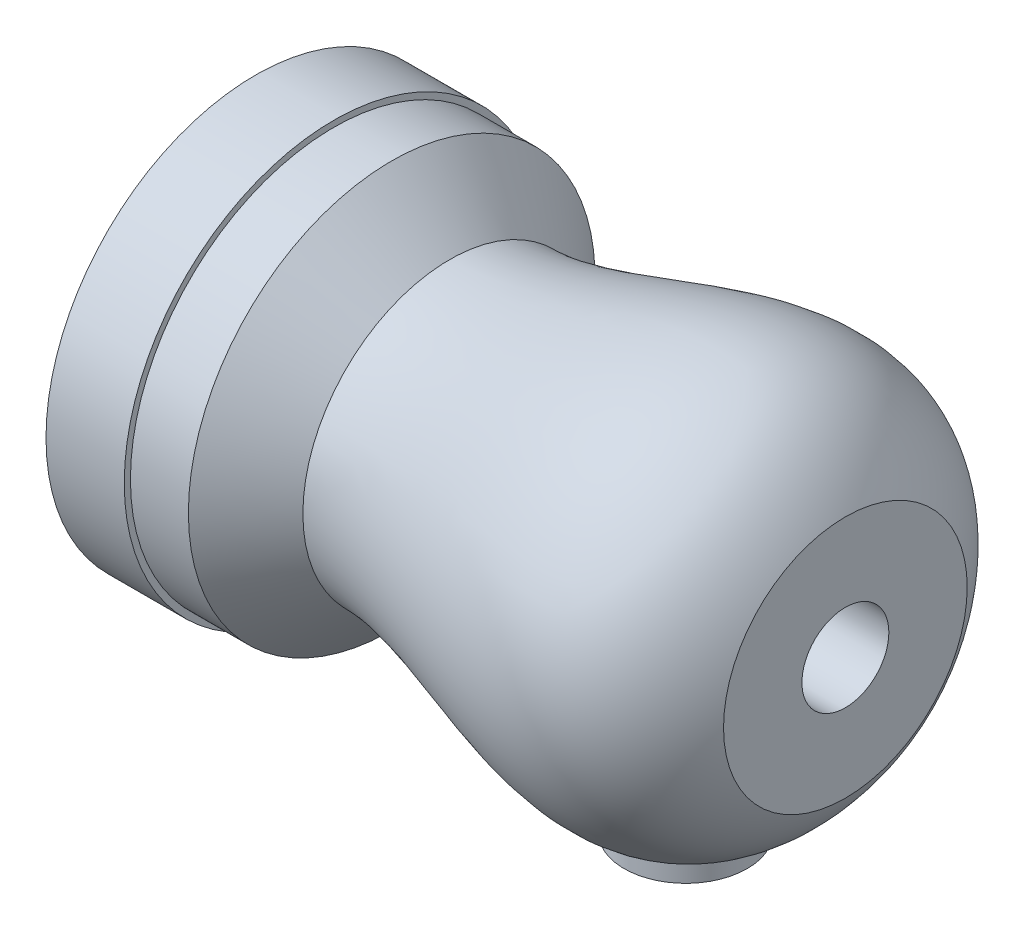
ISO-10303-21;
HEADER;
FILE_DESCRIPTION(('STEP AP214'),'2;1');
FILE_NAME('part.step','',(''),(''),'','','');
FILE_SCHEMA(('AUTOMOTIVE_DESIGN { 1 0 10303 214 1 1 1 1 }'));
ENDSEC;
DATA;
#1=APPLICATION_CONTEXT('core data for automotive mechanical design processes');
#2=APPLICATION_PROTOCOL_DEFINITION('international standard','automotive_design',2000,#1);
#3=PRODUCT_CONTEXT('',#1,'mechanical');
#4=PRODUCT('Part','Part','',(#3));
#5=PRODUCT_RELATED_PRODUCT_CATEGORY('part','',(#4));
#6=PRODUCT_DEFINITION_FORMATION('','',#4);
#7=PRODUCT_DEFINITION_CONTEXT('part definition',#1,'design');
#8=PRODUCT_DEFINITION('design','',#6,#7);
#9=PRODUCT_DEFINITION_SHAPE('','',#8);
#10=(LENGTH_UNIT() NAMED_UNIT(*) SI_UNIT(.MILLI.,.METRE.));
#11=(NAMED_UNIT(*) PLANE_ANGLE_UNIT() SI_UNIT($,.RADIAN.));
#12=(NAMED_UNIT(*) SI_UNIT($,.STERADIAN.) SOLID_ANGLE_UNIT());
#13=UNCERTAINTY_MEASURE_WITH_UNIT(LENGTH_MEASURE(1.E-05),#10,'distance_accuracy_value','');
#14=(GEOMETRIC_REPRESENTATION_CONTEXT(3) GLOBAL_UNCERTAINTY_ASSIGNED_CONTEXT((#13)) GLOBAL_UNIT_ASSIGNED_CONTEXT((#10,
#11,#12)) REPRESENTATION_CONTEXT('',''));
#15=CARTESIAN_POINT('',(0.,0.,0.));
#16=DIRECTION('',(0.,0.,1.));
#17=DIRECTION('',(1.,0.,0.));
#18=AXIS2_PLACEMENT_3D('',#15,#16,#17);
#19=CARTESIAN_POINT('',(176.495570271617,42.0294814328911,0.));
#20=CARTESIAN_POINT('',(143.705322116077,100.003369352292,0.));
#21=CARTESIAN_POINT('',(85.3897214599743,50.7333126279115,0.));
#22=CARTESIAN_POINT('',(40.,50.6507572834825,0.));
#23=B_SPLINE_CURVE_WITH_KNOTS('',3,(#19,#20,#21,#22),.UNSPECIFIED.,.F.,.F.,(4,4),(0.,1.),.UNSPECIFIED.);
#24=CARTESIAN_POINT('',(0.,0.,0.));
#25=DIRECTION('',(-1.,0.,0.));
#26=AXIS1_PLACEMENT('',#24,#25);
#27=SURFACE_OF_REVOLUTION('',#23,#26);
#28=CARTESIAN_POINT('',(176.495570271617,0.,0.));
#29=DIRECTION('',(-1.,0.,0.));
#30=DIRECTION('',(0.,0.,1.));
#31=AXIS2_PLACEMENT_3D('',#28,#29,#30);
#32=CIRCLE('',#31,42.0294814328911);
#33=CARTESIAN_POINT('',(176.495570271617,0.,42.0294814328911));
#34=VERTEX_POINT('',#33);
#35=EDGE_CURVE('E112',#34,#34,#32,.T.);
#36=ORIENTED_EDGE('',*,*,#35,.T.);
#37=EDGE_LOOP('',(#36));
#38=FACE_BOUND('',#37,.T.);
#39=CARTESIAN_POINT('',(40.,0.,0.));
#40=DIRECTION('',(-1.,0.,0.));
#41=DIRECTION('',(0.,0.,1.));
#42=AXIS2_PLACEMENT_3D('',#39,#40,#41);
#43=CIRCLE('',#42,50.6507572834825);
#44=CARTESIAN_POINT('',(40.,0.,50.6507572834825));
#45=VERTEX_POINT('',#44);
#46=EDGE_CURVE('E114',#45,#45,#43,.T.);
#47=ORIENTED_EDGE('',*,*,#46,.F.);
#48=EDGE_LOOP('',(#47));
#49=FACE_BOUND('',#48,.T.);
#50=CARTESIAN_POINT('',(121.401340982903,-66.234012494018,-21.25));
#51=CARTESIAN_POINT('',(122.003957982203,-66.3167599790187,-21.2500045300251));
#52=CARTESIAN_POINT('',(122.606216079359,-66.4015069637167,-21.2243586624418));
#53=CARTESIAN_POINT('',(123.806235777613,-66.5734372812848,-21.1220645786052));
#54=CARTESIAN_POINT('',(124.403996165585,-66.6606212435302,-21.0454030682312));
#55=CARTESIAN_POINT('',(125.591398067185,-66.8358485961059,-20.8415267641632));
#56=CARTESIAN_POINT('',(126.181029715917,-66.9238928411712,-20.7142553301676));
#57=CARTESIAN_POINT('',(127.347429843309,-67.0991153764761,-20.4100403479368));
#58=CARTESIAN_POINT('',(127.924199175922,-67.1862937239899,-20.2331001079707));
#59=CARTESIAN_POINT('',(129.060811307519,-67.3582411691843,-19.8307434150008));
#60=CARTESIAN_POINT('',(129.620657545908,-67.4430107562023,-19.6053368887474));
#61=CARTESIAN_POINT('',(130.719625591626,-67.6087794303558,-19.1074845679912));
#62=CARTESIAN_POINT('',(131.258747083308,-67.6897784600683,-18.8350380573979));
#63=CARTESIAN_POINT('',(132.312217291834,-67.8467934365864,-18.2449895290065));
#64=CARTESIAN_POINT('',(132.826574057052,-67.9228110052736,-17.9274023160735));
#65=CARTESIAN_POINT('',(133.826928780006,-68.0689377317553,-17.2491288342234));
#66=CARTESIAN_POINT('',(134.312927051726,-68.13904695497,-16.8884430426235));
#67=CARTESIAN_POINT('',(135.250030549563,-68.2722436050248,-16.1287897584023));
#68=CARTESIAN_POINT('',(135.70133243024,-68.3353716587939,-15.7300719964799));
#69=CARTESIAN_POINT('',(136.568939742958,-68.4546613968304,-14.8952627342508));
#70=CARTESIAN_POINT('',(136.985245230865,-68.5108230922187,-14.459171293608));
#71=CARTESIAN_POINT('',(137.779683052371,-68.6159799601773,-13.5526978040432));
#72=CARTESIAN_POINT('',(138.157815346672,-68.6649751253698,-13.0823157198207));
#73=CARTESIAN_POINT('',(138.872994999654,-68.7558092821973,-12.1106441612038));
#74=CARTESIAN_POINT('',(139.210042743245,-68.7976483408773,-11.6093549764357));
#75=CARTESIAN_POINT('',(139.836107684897,-68.8738224284479,-10.5866145378172));
#76=CARTESIAN_POINT('',(140.125722502654,-68.9082528788129,-10.0655360960294));
#77=CARTESIAN_POINT('',(140.660286844037,-68.9706158244899,-9.00058152336909));
#78=CARTESIAN_POINT('',(140.905236773021,-68.9985483787747,-8.45670559945187));
#79=CARTESIAN_POINT('',(141.348633305942,-69.0482616845713,-7.35005739808419));
#80=CARTESIAN_POINT('',(141.547080735037,-69.0700425452425,-6.78728545613469));
#81=CARTESIAN_POINT('',(141.895997203266,-69.1078075114209,-5.64686973023211));
#82=CARTESIAN_POINT('',(142.046466241317,-69.1237916167972,-5.06922594594312));
#83=CARTESIAN_POINT('',(142.297784675641,-69.1502222154461,-3.90563088654723));
#84=CARTESIAN_POINT('',(142.398837307729,-69.160691403992,-3.31972401047234));
#85=CARTESIAN_POINT('',(142.55151026833,-69.1764242154281,-2.1414373684221));
#86=CARTESIAN_POINT('',(142.603130772608,-69.1816878568276,-1.54905762546986));
#87=CARTESIAN_POINT('',(142.656561540501,-69.187135041618,-0.362034305631213));
#88=CARTESIAN_POINT('',(142.658371913696,-69.1873185961849,0.232609266272018));
#89=CARTESIAN_POINT('',(142.612169507954,-69.1826101243166,1.4199382334047));
#90=CARTESIAN_POINT('',(142.564156674582,-69.1777180923361,2.01262362649401));
#91=CARTESIAN_POINT('',(142.418635135676,-69.1627389608207,3.19202175517637));
#92=CARTESIAN_POINT('',(142.321109897238,-69.1526501259824,3.77873242892954));
#93=CARTESIAN_POINT('',(142.077271447734,-69.1270514302526,4.94180615295374));
#94=CARTESIAN_POINT('',(141.930958248918,-69.1115415707225,5.51816920582318));
#95=CARTESIAN_POINT('',(141.590625301726,-69.0747951111576,6.65643771696823));
#96=CARTESIAN_POINT('',(141.396606253653,-69.0535585951874,7.21834338733894));
#97=CARTESIAN_POINT('',(140.96229725852,-69.0050099858598,8.32370721658004));
#98=CARTESIAN_POINT('',(140.72200734552,-68.9776978969745,8.86716538902885));
#99=CARTESIAN_POINT('',(140.197030322258,-68.9166633206401,9.93159595420715));
#100=CARTESIAN_POINT('',(139.912358019292,-68.8829429703606,10.452575772642));
#101=CARTESIAN_POINT('',(139.300679142264,-68.8087961943795,11.4685563723769));
#102=CARTESIAN_POINT('',(138.973672618082,-68.768369776579,11.9635571842847));
#103=CARTESIAN_POINT('',(138.279769413145,-68.6806281699443,12.9240929843224));
#104=CARTESIAN_POINT('',(137.912873660234,-68.6333131413339,13.3896286574269));
#105=CARTESIAN_POINT('',(137.14190979907,-68.5317631556251,14.2880148342655));
#106=CARTESIAN_POINT('',(136.737841628695,-68.4775281869621,14.7208652833736));
#107=CARTESIAN_POINT('',(135.894858688906,-68.362210656287,15.5515645163));
#108=CARTESIAN_POINT('',(135.455890993059,-68.3011176336741,15.9493581320392));
#109=CARTESIAN_POINT('',(134.546860022997,-68.1725346329196,16.7065179649474));
#110=CARTESIAN_POINT('',(134.076796743471,-68.1050446536853,17.0658841755525));
#111=CARTESIAN_POINT('',(133.108918574364,-67.9642789952212,17.7438513097352));
#112=CARTESIAN_POINT('',(132.611101997867,-67.8910029641875,18.0624497514582));
#113=CARTESIAN_POINT('',(131.591242314525,-67.7395157406808,18.6568156476806));
#114=CARTESIAN_POINT('',(131.069198977734,-67.6613045013631,18.9325826955414));
#115=CARTESIAN_POINT('',(129.998721498627,-67.5001428392745,19.4422932355546));
#116=CARTESIAN_POINT('',(129.45006311242,-67.4171503328113,19.6757525063233));
#117=CARTESIAN_POINT('',(128.335440095248,-67.2485000567285,20.0956576727819));
#118=CARTESIAN_POINT('',(127.769475339763,-67.1628422679323,20.2821032301212));
#119=CARTESIAN_POINT('',(126.624009610692,-66.9902979604501,20.6068107463411));
#120=CARTESIAN_POINT('',(126.044507283121,-66.9034113192044,20.7450678633694));
#121=CARTESIAN_POINT('',(124.87589381478,-66.7299653270269,20.9724660533488));
#122=CARTESIAN_POINT('',(124.286782602685,-66.6434059785305,21.0616067615537));
#123=CARTESIAN_POINT('',(123.095175593833,-66.4710932185638,21.1909705424382));
#124=CARTESIAN_POINT('',(122.492605354982,-66.3853649091846,21.2305426817636));
#125=CARTESIAN_POINT('',(121.285772855895,-66.2175120781191,21.2582560402217));
#126=CARTESIAN_POINT('',(120.68151057897,-66.1353875921093,21.2463967503169));
#127=CARTESIAN_POINT('',(119.475544837851,-65.9762892424883,21.1711781469502));
#128=CARTESIAN_POINT('',(118.873841234508,-65.8993150953444,21.1078216710026));
#129=CARTESIAN_POINT('',(117.677247689856,-65.7518896726546,20.9298707543026));
#130=CARTESIAN_POINT('',(117.082357669134,-65.6814383210165,20.8152769113549));
#131=CARTESIAN_POINT('',(115.907970062168,-65.5486789103122,20.5364790786779));
#132=CARTESIAN_POINT('',(115.328392458215,-65.4863158390567,20.3726384575581));
#133=CARTESIAN_POINT('',(114.18447919698,-65.3699696494513,19.9960491840794));
#134=CARTESIAN_POINT('',(113.620143489982,-65.3159865037649,19.7833006912711));
#135=CARTESIAN_POINT('',(112.511000381505,-65.2168985861254,19.3103025907736));
#136=CARTESIAN_POINT('',(111.966190956364,-65.1717928919437,19.0500579226147));
#137=CARTESIAN_POINT('',(110.900178214127,-65.0905858267725,18.4838391855692));
#138=CARTESIAN_POINT('',(110.378974572432,-65.0544843319369,18.1778657457402));
#139=CARTESIAN_POINT('',(109.373840800372,-64.9916581038749,17.5286292140295));
#140=CARTESIAN_POINT('',(108.889389221732,-64.9647675991405,17.1861890310022));
#141=CARTESIAN_POINT('',(107.950585125956,-64.918884649817,16.4618096187886));
#142=CARTESIAN_POINT('',(107.496232223766,-64.8998921041725,16.0798708950694));
#143=CARTESIAN_POINT('',(106.620931106776,-64.8689844706626,15.2791951086572));
#144=CARTESIAN_POINT('',(106.199983375656,-64.8570694852582,14.8604575133322));
#145=CARTESIAN_POINT('',(105.394537745715,-64.8392725994367,13.9891646108447));
#146=CARTESIAN_POINT('',(105.010039994107,-64.8333907233849,13.5366091671129));
#147=CARTESIAN_POINT('',(104.281039027241,-64.8264657494731,12.6019154611968));
#148=CARTESIAN_POINT('',(103.936450456852,-64.8254121317422,12.1198438356098));
#149=CARTESIAN_POINT('',(103.288727068269,-64.8268375468115,11.1286223024599));
#150=CARTESIAN_POINT('',(102.985592120716,-64.8293165685878,10.6194724794028));
#151=CARTESIAN_POINT('',(102.422886769268,-64.8365206078819,9.57764554085865));
#152=CARTESIAN_POINT('',(102.163317312469,-64.8412456742193,9.0449679142041));
#153=CARTESIAN_POINT('',(101.689556602401,-64.8517172553234,7.95980943791867));
#154=CARTESIAN_POINT('',(101.475365621282,-64.8574637762156,7.40732846954368));
#155=CARTESIAN_POINT('',(101.092362635624,-64.8689259390683,6.28202949016062));
#156=CARTESIAN_POINT('',(100.923918260852,-64.8746409889646,5.70908630876263));
#157=CARTESIAN_POINT('',(100.63582940115,-64.8850619288187,4.55104868119178));
#158=CARTESIAN_POINT('',(100.5161851418,-64.8897678141116,3.96595417886193));
#159=CARTESIAN_POINT('',(100.326548291604,-64.89747786581,2.78776473431331));
#160=CARTESIAN_POINT('',(100.256555420893,-64.9004820418075,2.19466983720863));
#161=CARTESIAN_POINT('',(100.16671985339,-64.9043717997164,1.0046876724294));
#162=CARTESIAN_POINT('',(100.146877098368,-64.9052573840877,0.40780040915906));
#163=CARTESIAN_POINT('',(100.157487694357,-64.9047899767804,-0.786003638350751));
#164=CARTESIAN_POINT('',(100.187981260791,-64.9034351951945,-1.38292006482707));
#165=CARTESIAN_POINT('',(100.299122557877,-64.8986677088482,-2.57205731480323));
#166=CARTESIAN_POINT('',(100.379770357112,-64.8952550012737,-3.16427813188101));
#167=CARTESIAN_POINT('',(100.590647329175,-64.8868503929555,-4.33983175862368));
#168=CARTESIAN_POINT('',(100.720877973918,-64.8818584453312,-4.92316430389655));
#169=CARTESIAN_POINT('',(101.029993683266,-64.871044335148,-6.07678434984397));
#170=CARTESIAN_POINT('',(101.208878772884,-64.8652221721623,-6.64707184381174));
#171=CARTESIAN_POINT('',(101.614048422756,-64.8537273629831,-7.7705981662495));
#172=CARTESIAN_POINT('',(101.840336193793,-64.8480547269471,-8.32383583694975));
#173=CARTESIAN_POINT('',(102.338702102745,-64.8380194664313,-9.40930121517322));
#174=CARTESIAN_POINT('',(102.610780271638,-64.8336568428378,-9.9415289084826));
#175=CARTESIAN_POINT('',(103.198787407378,-64.8275195823868,-10.9811739610099));
#176=CARTESIAN_POINT('',(103.514714681739,-64.8257448456725,-11.4885922767978));
#177=CARTESIAN_POINT('',(104.188178017464,-64.8261082849862,-12.4750216710193));
#178=CARTESIAN_POINT('',(104.545713964012,-64.8282464502169,-12.9540328278353));
#179=CARTESIAN_POINT('',(105.29950616445,-64.8377288013333,-13.8798209674084));
#180=CARTESIAN_POINT('',(105.695729079199,-64.8450685382289,-14.3266251377789));
#181=CARTESIAN_POINT('',(106.524282012754,-64.8661380865324,-15.1852409879258));
#182=CARTESIAN_POINT('',(106.956612123189,-64.8798679141566,-15.5970525788972));
#183=CARTESIAN_POINT('',(107.854274685801,-64.9147297199817,-16.3827754992126));
#184=CARTESIAN_POINT('',(108.319611806328,-64.9358627469266,-16.7566814491272));
#185=CARTESIAN_POINT('',(109.279783045165,-64.9862945132632,-17.4638433661604));
#186=CARTESIAN_POINT('',(109.774616547836,-65.0155930822733,-17.7971001812526));
#187=CARTESIAN_POINT('',(110.7862818925,-65.0825680840686,-18.4182706673814));
#188=CARTESIAN_POINT('',(111.302919985972,-65.1201797572522,-18.7065069359182));
#189=CARTESIAN_POINT('',(112.357879661014,-65.2040367595828,-19.2386948858523));
#190=CARTESIAN_POINT('',(112.896202385172,-65.2502825441392,-19.4826442299807));
#191=CARTESIAN_POINT('',(113.99009347084,-65.3511556051788,-19.9244446447138));
#192=CARTESIAN_POINT('',(114.545645049437,-65.4057749175123,-20.1223390729505));
#193=CARTESIAN_POINT('',(115.670326489404,-65.522872265515,-20.47106828089));
#194=CARTESIAN_POINT('',(116.239453248291,-65.5853485192354,-20.6219137043616));
#195=CARTESIAN_POINT('',(117.56721120133,-65.738024767396,-20.9154833828127));
#196=CARTESIAN_POINT('',(118.32943368451,-65.830783821074,-21.0409079480146));
#197=CARTESIAN_POINT('',(119.861746146375,-66.0259459331337,-21.2081636164637));
#198=CARTESIAN_POINT('',(120.631836172492,-66.1283490496886,-21.2499942154369));
#199=CARTESIAN_POINT('',(121.401340982903,-66.234012494018,-21.25));
#200=B_SPLINE_CURVE_WITH_KNOTS('',3,(#50,#51,#52,#53,#54,#55,#56,#57,#58,#59,#60,#61,#62,#63,
#64,#65,#66,#67,#68,#69,#70,#71,#72,#73,#74,#75,#76,#77,#78,#79,#80,#81,#82,#83,#84,#85,#86,#87,
#88,#89,#90,#91,#92,#93,#94,#95,#96,#97,#98,#99,#100,#101,#102,#103,#104,#105,#106,#107,#108,
#109,#110,#111,#112,#113,#114,#115,#116,#117,#118,#119,#120,#121,#122,#123,#124,#125,#126,#127,
#128,#129,#130,#131,#132,#133,#134,#135,#136,#137,#138,#139,#140,#141,#142,#143,#144,#145,#146,
#147,#148,#149,#150,#151,#152,#153,#154,#155,#156,#157,#158,#159,#160,#161,#162,#163,#164,#165,
#166,#167,#168,#169,#170,#171,#172,#173,#174,#175,#176,#177,#178,#179,#180,#181,#182,#183,#184,
#185,#186,#187,#188,#189,#190,#191,#192,#193,#194,#195,#196,#197,#198,#199),.UNSPECIFIED.,.T.,
.F.,(4,2,2,2,2,2,2,2,2,2,2,2,2,2,2,2,2,2,2,2,2,2,2,2,2,2,2,2,2,2,2,2,2,2,2,2,2,2,2,2,2,2,2,2,2,
2,2,2,2,2,2,2,2,2,2,2,2,2,2,2,2,2,2,2,2,2,2,2,2,2,2,2,2,2,4),(0.,1.82413237733515,
3.64874028993243,5.47539599299387,7.30193005762967,9.12809037161787,10.9542784877251,
12.779869042247,14.6054393802136,16.4197544213985,18.2340665662353,20.048380578835,
21.8626775923149,23.6519848206868,25.4412758092613,27.2305350455521,29.0197943222571,
30.8016316590683,32.5834626601831,34.3652897413655,36.1471187693083,37.9295431672662,
39.7119671176295,41.4943649042528,43.2767613789,45.0585644601976,46.8403654421879,
48.6221249875227,50.4038875106012,52.1884056653107,53.9729241248385,55.7575511704043,
57.5421951580761,59.3461268031857,61.1500714305508,62.9541972614853,64.7583364899655,
66.5859273914394,68.4135363813557,70.2410446761541,72.0685316493157,73.8828523380605,
75.6971671080876,77.511293299536,79.3253945376597,81.1048814732631,82.8843456393995,
84.6638355659888,86.4433326792222,88.218950752174,89.994563284081,91.7702144121177,
93.5458761890342,95.3354115382791,97.1249551596539,98.91448869404,100.704020150555,
102.494982017568,104.285946333612,106.076963820383,107.867982227937,109.65912198797,
111.450262959739,113.241334816319,115.032401730667,116.82193856195,118.611479934637,
120.401274917987,122.191032558388,123.967310679014,125.743682516541,127.5183751916,
129.292666091057,131.621956790307,133.951261540781),.UNSPECIFIED.);
#201=CARTESIAN_POINT('',(121.401340982903,-66.234012494018,-21.25));
#202=VERTEX_POINT('',#201);
#203=EDGE_CURVE('E11',#202,#202,#200,.T.);
#204=ORIENTED_EDGE('',*,*,#203,.F.);
#205=EDGE_LOOP('',(#204));
#206=FACE_BOUND('',#205,.T.);
#207=ADVANCED_FACE('F45',(#38,#49,#206),#27,.T.);
#208=CARTESIAN_POINT('',(0.,0.,0.));
#209=DIRECTION('',(-1.,0.,0.));
#210=DIRECTION('',(0.,0.,1.));
#211=AXIS2_PLACEMENT_3D('',#208,#209,#210);
#212=CYLINDRICAL_SURFACE('',#211,70.1433562648399);
#213=CARTESIAN_POINT('',(0.,0.,0.));
#214=DIRECTION('',(-1.,0.,0.));
#215=DIRECTION('',(0.,0.,1.));
#216=AXIS2_PLACEMENT_3D('',#213,#214,#215);
#217=CIRCLE('',#216,70.1433562648399);
#218=CARTESIAN_POINT('',(0.,0.,70.1433562648399));
#219=VERTEX_POINT('',#218);
#220=EDGE_CURVE('E53',#219,#219,#217,.T.);
#221=ORIENTED_EDGE('',*,*,#220,.F.);
#222=EDGE_LOOP('',(#221));
#223=FACE_BOUND('',#222,.T.);
#224=CARTESIAN_POINT('',(20.,0.,0.));
#225=DIRECTION('',(-1.,0.,0.));
#226=DIRECTION('',(0.,0.,1.));
#227=AXIS2_PLACEMENT_3D('',#224,#225,#226);
#228=CIRCLE('',#227,70.1433562648399);
#229=CARTESIAN_POINT('',(20.,0.,70.1433562648399));
#230=VERTEX_POINT('',#229);
#231=EDGE_CURVE('E57',#230,#230,#228,.T.);
#232=ORIENTED_EDGE('',*,*,#231,.T.);
#233=EDGE_LOOP('',(#232));
#234=FACE_BOUND('',#233,.T.);
#235=ADVANCED_FACE('F47',(#223,#234),#212,.T.);
#236=CARTESIAN_POINT('',(40.,0.,0.));
#237=DIRECTION('',(-1.,0.,0.));
#238=DIRECTION('',(0.,0.,1.));
#239=AXIS2_PLACEMENT_3D('',#236,#237,#238);
#240=CONICAL_SURFACE('',#239,50.6507572834825,0.7725508675648);
#241=ORIENTED_EDGE('',*,*,#231,.F.);
#242=EDGE_LOOP('',(#241));
#243=FACE_BOUND('',#242,.T.);
#244=ORIENTED_EDGE('',*,*,#46,.T.);
#245=EDGE_LOOP('',(#244));
#246=FACE_BOUND('',#245,.T.);
#247=ADVANCED_FACE('F81',(#243,#246),#240,.T.);
#248=CARTESIAN_POINT('',(176.495570271617,0.,0.));
#249=DIRECTION('',(-1.,0.,0.));
#250=DIRECTION('',(0.,0.,1.));
#251=AXIS2_PLACEMENT_3D('',#248,#249,#250);
#252=PLANE('',#251);
#253=CARTESIAN_POINT('',(176.495570271617,0.,0.));
#254=DIRECTION('',(1.,0.,0.));
#255=DIRECTION('',(0.,0.,-1.));
#256=AXIS2_PLACEMENT_3D('',#253,#254,#255);
#257=CIRCLE('',#256,15.);
#258=CARTESIAN_POINT('',(176.495570271617,0.,-15.));
#259=VERTEX_POINT('',#258);
#260=EDGE_CURVE('E144',#259,#259,#257,.T.);
#261=ORIENTED_EDGE('',*,*,#260,.F.);
#262=EDGE_LOOP('',(#261));
#263=FACE_BOUND('',#262,.T.);
#264=ORIENTED_EDGE('',*,*,#35,.F.);
#265=EDGE_LOOP('',(#264));
#266=FACE_BOUND('',#265,.T.);
#267=ADVANCED_FACE('F76',(#263,#266),#252,.F.);
#268=CARTESIAN_POINT('',(121.401340982903,-37.,0.));
#269=DIRECTION('',(0.,-1.,0.));
#270=DIRECTION('',(0.,0.,-1.));
#271=AXIS2_PLACEMENT_3D('',#268,#269,#270);
#272=CYLINDRICAL_SURFACE('',#271,21.25);
#273=CARTESIAN_POINT('',(121.401340982903,-80.,0.));
#274=DIRECTION('',(0.,1.,0.));
#275=DIRECTION('',(1.,0.,0.));
#276=AXIS2_PLACEMENT_3D('',#273,#274,#275);
#277=CIRCLE('',#276,21.25);
#278=CARTESIAN_POINT('',(142.651340982903,-80.,0.));
#279=VERTEX_POINT('',#278);
#280=EDGE_CURVE('E113',#279,#279,#277,.T.);
#281=ORIENTED_EDGE('',*,*,#280,.T.);
#282=EDGE_LOOP('',(#281));
#283=FACE_BOUND('',#282,.T.);
#284=ORIENTED_EDGE('',*,*,#203,.T.);
#285=EDGE_LOOP('',(#284));
#286=FACE_BOUND('',#285,.T.);
#287=ADVANCED_FACE('F72',(#283,#286),#272,.T.);
#288=CARTESIAN_POINT('',(121.401340982903,-37.,0.));
#289=DIRECTION('',(0.,-1.,0.));
#290=DIRECTION('',(0.,0.,-1.));
#291=AXIS2_PLACEMENT_3D('',#288,#289,#290);
#292=CYLINDRICAL_SURFACE('',#291,11.25);
#293=CARTESIAN_POINT('',(121.401340982903,-80.,0.));
#294=DIRECTION('',(0.,1.,0.));
#295=DIRECTION('',(0.,0.,1.));
#296=AXIS2_PLACEMENT_3D('',#293,#294,#295);
#297=CIRCLE('',#296,11.25);
#298=CARTESIAN_POINT('',(121.401340982903,-80.,11.25));
#299=VERTEX_POINT('',#298);
#300=EDGE_CURVE('E117',#299,#299,#297,.T.);
#301=ORIENTED_EDGE('',*,*,#300,.F.);
#302=EDGE_LOOP('',(#301));
#303=FACE_BOUND('',#302,.T.);
#304=CARTESIAN_POINT('',(121.401340982903,-68.6436042982719,-11.25));
#305=CARTESIAN_POINT('',(121.72013750407,-68.6858432806848,-11.2500020748457));
#306=CARTESIAN_POINT('',(122.038825126775,-68.7286238251864,-11.2364441421478));
#307=CARTESIAN_POINT('',(122.673918555166,-68.8148383738677,-11.1823351340703));
#308=CARTESIAN_POINT('',(122.990323721734,-68.8582725513103,-11.141776773782));
#309=CARTESIAN_POINT('',(123.618873317469,-68.9453578823592,-11.0338955529526));
#310=CARTESIAN_POINT('',(123.931012589769,-68.9890092242042,-10.966542831771));
#311=CARTESIAN_POINT('',(124.548479567009,-69.0760018957273,-10.805545401922));
#312=CARTESIAN_POINT('',(124.853807304653,-69.1193432268931,-10.7119008195125));
#313=CARTESIAN_POINT('',(125.455384754985,-69.2052251805989,-10.4989998267323));
#314=CARTESIAN_POINT('',(125.75163781404,-69.2477660960112,-10.3797529905584));
#315=CARTESIAN_POINT('',(126.333087921444,-69.3316055127201,-10.1164335683553));
#316=CARTESIAN_POINT('',(126.618284786784,-69.3729039934485,-9.9723605715984));
#317=CARTESIAN_POINT('',(127.175495660686,-69.4538115622306,-9.66041188097825));
#318=CARTESIAN_POINT('',(127.447513343688,-69.4934211207928,-9.49254287343165));
#319=CARTESIAN_POINT('',(127.976479651238,-69.5705603784249,-9.13411833855874));
#320=CARTESIAN_POINT('',(128.233428390976,-69.6080900933933,-8.94356298468404));
#321=CARTESIAN_POINT('',(128.729590428042,-69.6805908792442,-8.54171256990348));
#322=CARTESIAN_POINT('',(128.968857062232,-69.7155696403189,-8.33048475680628));
#323=CARTESIAN_POINT('',(129.428778834393,-69.7827789198833,-7.8882516889115));
#324=CARTESIAN_POINT('',(129.649433969481,-69.815009437947,-7.65724643104928));
#325=CARTESIAN_POINT('',(130.070482433856,-69.8764462176778,-7.17707792112894));
#326=CARTESIAN_POINT('',(130.270875695515,-69.9056524692509,-6.92791460847006));
#327=CARTESIAN_POINT('',(130.649881448527,-69.9608080669396,-6.41320048120145));
#328=CARTESIAN_POINT('',(130.828494125481,-69.9867574408086,-6.14764980626516));
#329=CARTESIAN_POINT('',(131.160808622616,-70.034953293844,-5.60494966449207));
#330=CARTESIAN_POINT('',(131.314753487558,-70.0572359675213,-5.32795221515476));
#331=CARTESIAN_POINT('',(131.598819316603,-70.0982801494057,-4.76174895424651));
#332=CARTESIAN_POINT('',(131.728940432261,-70.1170416800126,-4.47254322035328));
#333=CARTESIAN_POINT('',(131.964362595487,-70.150929928652,-3.88400820032964));
#334=CARTESIAN_POINT('',(132.069664730064,-70.1660568058739,-3.58467935822347));
#335=CARTESIAN_POINT('',(132.254648941527,-70.1925932976068,-2.97804634993888));
#336=CARTESIAN_POINT('',(132.334331153453,-70.2040029317112,-2.67074222580699));
#337=CARTESIAN_POINT('',(132.466845850205,-70.2229585964018,-2.05326292497296));
#338=CARTESIAN_POINT('',(132.519920130073,-70.2305394254823,-1.74314068451439));
#339=CARTESIAN_POINT('',(132.599917487458,-70.2419597564116,-1.11947413705906));
#340=CARTESIAN_POINT('',(132.626840738671,-70.2457992831102,-0.805929852805597));
#341=CARTESIAN_POINT('',(132.654331488132,-70.2497196959311,-0.177673515608056));
#342=CARTESIAN_POINT('',(132.654899721022,-70.2498006868221,0.137038504540962));
#343=CARTESIAN_POINT('',(132.629677972005,-70.2462039337945,0.765382965946331));
#344=CARTESIAN_POINT('',(132.603888015947,-70.242526193562,1.07901540826112));
#345=CARTESIAN_POINT('',(132.526299015827,-70.2314504057978,1.70172532943789));
#346=CARTESIAN_POINT('',(132.47460266167,-70.2240670467276,2.0108158713306));
#347=CARTESIAN_POINT('',(132.345642456295,-70.2056219380737,2.62350315531253));
#348=CARTESIAN_POINT('',(132.26837869994,-70.1945602021378,2.927099917781));
#349=CARTESIAN_POINT('',(132.088863563503,-70.1688131409341,3.52665328291984));
#350=CARTESIAN_POINT('',(131.986612324708,-70.1541278361551,3.82260992877961));
#351=CARTESIAN_POINT('',(131.757885262671,-70.1212120704981,4.4048051252985));
#352=CARTESIAN_POINT('',(131.631409374556,-70.1029816001263,4.69104364993065));
#353=CARTESIAN_POINT('',(131.354905081805,-70.0630430997117,5.25234510090381));
#354=CARTESIAN_POINT('',(131.204831700971,-70.0413284272221,5.52738539694757));
#355=CARTESIAN_POINT('',(130.882419348205,-69.9945853394044,6.06379207856205));
#356=CARTESIAN_POINT('',(130.710080374783,-69.9695569238542,6.32515846321667));
#357=CARTESIAN_POINT('',(130.344396110744,-69.9163597802346,6.83242478029538));
#358=CARTESIAN_POINT('',(130.151050375443,-69.8881909856873,7.07832438513483));
#359=CARTESIAN_POINT('',(129.74475778254,-69.8289257496528,7.55297893952993));
#360=CARTESIAN_POINT('',(129.531810808188,-69.7978292907274,7.78173378695102));
#361=CARTESIAN_POINT('',(129.086160590399,-69.7327150928146,8.22222277798415));
#362=CARTESIAN_POINT('',(128.853319956126,-69.6986770159677,8.43381491803522));
#363=CARTESIAN_POINT('',(128.37096374193,-69.6281836766415,8.83660498063523));
#364=CARTESIAN_POINT('',(128.121448091803,-69.5917284039857,9.02780281731355));
#365=CARTESIAN_POINT('',(127.607499965171,-69.5167374573239,9.38853897308016));
#366=CARTESIAN_POINT('',(127.343066737159,-69.4782016785121,9.55807619956093));
#367=CARTESIAN_POINT('',(126.801147834754,-69.3994262615021,9.87436158226807));
#368=CARTESIAN_POINT('',(126.523662067451,-69.3591866111758,10.0211095762455));
#369=CARTESIAN_POINT('',(125.954491448233,-69.2769661237242,10.2923160776707));
#370=CARTESIAN_POINT('',(125.662685317801,-69.2349711440676,10.4165158274082));
#371=CARTESIAN_POINT('',(125.069746165177,-69.1500997407826,10.6398151111705));
#372=CARTESIAN_POINT('',(124.768613075239,-69.1072233107526,10.7389144628337));
#373=CARTESIAN_POINT('',(124.159102764112,-69.0210487523286,10.9113502017862));
#374=CARTESIAN_POINT('',(123.850725214131,-68.9777506048472,10.9846854173386));
#375=CARTESIAN_POINT('',(123.228876611678,-68.8912032090288,11.1050849868809));
#376=CARTESIAN_POINT('',(122.915405545191,-68.8479539608268,11.1521492685679));
#377=CARTESIAN_POINT('',(122.283242796558,-68.7616556887233,11.2199170291309));
#378=CARTESIAN_POINT('',(121.964529716529,-68.7186104212802,11.2404258892829));
#379=CARTESIAN_POINT('',(121.326380680176,-68.6335009114471,11.2542764425833));
#380=CARTESIAN_POINT('',(121.006944719598,-68.5914366748443,11.2476179755088));
#381=CARTESIAN_POINT('',(120.369614309321,-68.5087221835011,11.207140392572));
#382=CARTESIAN_POINT('',(120.051719851839,-68.4680719216149,11.1733214139879));
#383=CARTESIAN_POINT('',(119.419740802403,-68.3885793485371,11.0787114049118));
#384=CARTESIAN_POINT('',(119.105656193582,-68.3497370293391,11.0179204938752));
#385=CARTESIAN_POINT('',(118.484327137465,-68.2742985118733,10.8699248447529));
#386=CARTESIAN_POINT('',(118.177067722992,-68.2376970072519,10.7827856599872));
#387=CARTESIAN_POINT('',(117.570816814295,-68.1669214891968,10.5826030152173));
#388=CARTESIAN_POINT('',(117.271825316844,-68.1327474748153,10.4695595653279));
#389=CARTESIAN_POINT('',(116.684311451876,-68.0670499995628,10.2183266987663));
#390=CARTESIAN_POINT('',(116.395788658748,-68.0355264308678,10.0801383057527));
#391=CARTESIAN_POINT('',(115.831332690436,-67.9752826938659,9.7795575037043));
#392=CARTESIAN_POINT('',(115.555399424242,-67.9465625052915,9.61716526967669));
#393=CARTESIAN_POINT('',(115.020608362766,-67.8922584057292,9.27088510289517));
#394=CARTESIAN_POINT('',(114.761618694529,-67.8666484767716,9.0872048843325));
#395=CARTESIAN_POINT('',(114.259925467537,-67.8182862955858,8.6984702739044));
#396=CARTESIAN_POINT('',(114.017221818211,-67.7955340274648,8.49341600092189));
#397=CARTESIAN_POINT('',(113.549899779615,-67.752850540614,8.06338623482617));
#398=CARTESIAN_POINT('',(113.325280895103,-67.7329192446219,7.83841128758615));
#399=CARTESIAN_POINT('',(112.895784107883,-67.6957905801,7.37013824543359));
#400=CARTESIAN_POINT('',(112.690906140631,-67.6785932026316,7.12684021043325));
#401=CARTESIAN_POINT('',(112.303725720232,-67.6469151632656,6.62537255981262));
#402=CARTESIAN_POINT('',(112.121279697888,-67.6324168819653,6.36731488881319));
#403=CARTESIAN_POINT('',(111.778690525267,-67.6058458951376,5.83667989872408));
#404=CARTESIAN_POINT('',(111.618547266899,-67.5937731778545,5.56410265001357));
#405=CARTESIAN_POINT('',(111.321731304508,-67.5718924557815,5.00637186147902));
#406=CARTESIAN_POINT('',(111.185058404867,-67.5620844321159,4.72121842649865));
#407=CARTESIAN_POINT('',(110.93617495485,-67.5445720379291,4.14036628243902));
#408=CARTESIAN_POINT('',(110.823964411801,-67.536867668038,3.84466757020191));
#409=CARTESIAN_POINT('',(110.624988088057,-67.5234252385834,3.24534217441028));
#410=CARTESIAN_POINT('',(110.538179615959,-67.5176838771672,2.94172973732004));
#411=CARTESIAN_POINT('',(110.390379663156,-67.5080243628465,2.32825666565284));
#412=CARTESIAN_POINT('',(110.329388143464,-67.5041062071886,2.01839604051231));
#413=CARTESIAN_POINT('',(110.233660985457,-67.4979996568737,1.39462773328644));
#414=CARTESIAN_POINT('',(110.198925415662,-67.4958112667307,1.08072004064175));
#415=CARTESIAN_POINT('',(110.155960170084,-67.49310899686,0.451088589476642));
#416=CARTESIAN_POINT('',(110.14773051035,-67.4925951181463,0.135364829856746));
#417=CARTESIAN_POINT('',(110.157837641381,-67.4932286444114,-0.495739695163443));
#418=CARTESIAN_POINT('',(110.17618150758,-67.4943764918394,-0.811120346830666));
#419=CARTESIAN_POINT('',(110.239316577906,-67.4983638460376,-1.43921249715336));
#420=CARTESIAN_POINT('',(110.284107783944,-67.5012033529298,-1.75192399561613));
#421=CARTESIAN_POINT('',(110.399815240904,-67.5086444952502,-2.37245509847044));
#422=CARTESIAN_POINT('',(110.470731538288,-67.5132461338122,-2.68027469416114));
#423=CARTESIAN_POINT('',(110.638177980738,-67.5243180385724,-3.28883219274399));
#424=CARTESIAN_POINT('',(110.734708121381,-67.5307883044479,-3.58957009685901));
#425=CARTESIAN_POINT('',(110.952686328979,-67.5457326533793,-4.18182830626108));
#426=CARTESIAN_POINT('',(111.074134677922,-67.5542067591119,-4.47334850719212));
#427=CARTESIAN_POINT('',(111.341069477192,-67.573312824686,-5.045094039703));
#428=CARTESIAN_POINT('',(111.486555927775,-67.5839447845505,-5.32531937116241));
#429=CARTESIAN_POINT('',(111.80050347628,-67.6075276812327,-5.87246951894849));
#430=CARTESIAN_POINT('',(111.968963439757,-67.6204785035535,-6.13939499114184));
#431=CARTESIAN_POINT('',(112.327638395662,-67.64885636103,-6.65806562445215));
#432=CARTESIAN_POINT('',(112.517853358716,-67.6642833928421,-6.90981080606576));
#433=CARTESIAN_POINT('',(112.918576871317,-67.6977466216422,-7.39624737444374));
#434=CARTESIAN_POINT('',(113.129077660804,-67.7157818222228,-7.63094522264964));
#435=CARTESIAN_POINT('',(113.568901945569,-67.7545750499661,-8.08174270507481));
#436=CARTESIAN_POINT('',(113.798225499009,-67.7753330855425,-8.29784228182208));
#437=CARTESIAN_POINT('',(114.274085078408,-67.8196453592951,-8.709984115635));
#438=CARTESIAN_POINT('',(114.520625289632,-67.8432002783579,-8.90602146694147));
#439=CARTESIAN_POINT('',(115.029075599647,-67.8931191919043,-9.27662115136832));
#440=CARTESIAN_POINT('',(115.290985488432,-67.9194831480099,-9.45118377781268));
#441=CARTESIAN_POINT('',(115.8288810846,-67.9750412886266,-9.77800822227104));
#442=CARTESIAN_POINT('',(116.104896596833,-68.0042415942385,-9.93021994491424));
#443=CARTESIAN_POINT('',(116.668481284489,-68.065319917909,-10.2108589631546));
#444=CARTESIAN_POINT('',(116.956050583514,-68.0971979646181,-10.3392860042214));
#445=CARTESIAN_POINT('',(117.540394046224,-68.16343104692,-10.5713912071204));
#446=CARTESIAN_POINT('',(117.837158540856,-68.1977835277764,-10.6750944314319));
#447=CARTESIAN_POINT('',(118.437974009302,-68.2687520970293,-10.8572323963802));
#448=CARTESIAN_POINT('',(118.742023140868,-68.3053676167389,-10.9356734547105));
#449=CARTESIAN_POINT('',(119.43530831598,-68.3903896793657,-11.0839263465073));
#450=CARTESIAN_POINT('',(119.826112379428,-68.4393840084979,-11.1461737823726));
#451=CARTESIAN_POINT('',(120.611780258087,-68.5398436089779,-11.2292093748569));
#452=CARTESIAN_POINT('',(121.006644083119,-68.5913088863038,-11.2499974311666));
#453=CARTESIAN_POINT('',(121.401340982903,-68.6436042982719,-11.25));
#454=B_SPLINE_CURVE_WITH_KNOTS('',3,(#304,#305,#306,#307,#308,#309,#310,#311,#312,#313,#314,
#315,#316,#317,#318,#319,#320,#321,#322,#323,#324,#325,#326,#327,#328,#329,#330,#331,#332,#333,
#334,#335,#336,#337,#338,#339,#340,#341,#342,#343,#344,#345,#346,#347,#348,#349,#350,#351,#352,
#353,#354,#355,#356,#357,#358,#359,#360,#361,#362,#363,#364,#365,#366,#367,#368,#369,#370,#371,
#372,#373,#374,#375,#376,#377,#378,#379,#380,#381,#382,#383,#384,#385,#386,#387,#388,#389,#390,
#391,#392,#393,#394,#395,#396,#397,#398,#399,#400,#401,#402,#403,#404,#405,#406,#407,#408,#409,
#410,#411,#412,#413,#414,#415,#416,#417,#418,#419,#420,#421,#422,#423,#424,#425,#426,#427,#428,
#429,#430,#431,#432,#433,#434,#435,#436,#437,#438,#439,#440,#441,#442,#443,#444,#445,#446,#447,
#448,#449,#450,#451,#452,#453),.UNSPECIFIED.,.T.,.F.,(4,2,2,2,2,2,2,2,2,2,2,2,2,2,2,2,2,2,2,2,2,
2,2,2,2,2,2,2,2,2,2,2,2,2,2,2,2,2,2,2,2,2,2,2,2,2,2,2,2,2,2,2,2,2,2,2,2,2,2,2,2,2,2,2,2,2,2,2,2,
2,2,2,2,2,4),(0.,0.964399288470842,1.92905888428588,2.89479655811901,3.86052959440334,
4.82590211307912,5.79129060455906,6.75640837229705,7.72151876156743,8.68358786781712,
9.64565712314528,10.6077295894338,11.5697938568794,12.521703101229,13.4736062897738,
14.4254677795349,15.3773242520015,16.3203665662542,17.2634026167474,18.2064123802043,
19.1494212188492,20.0887213033358,21.0280179027643,21.9673091912101,22.9066029950585,
23.8477092674837,24.78881560296,25.7299418642551,26.6710737315717,27.6193321751402,
28.5675946112121,29.5159048608017,30.4642218616169,31.4228147452767,32.3814145931864,
33.34005803198,34.2987041091405,35.2643368476948,36.2299752812025,37.1956088340858,
38.1612381103389,39.1244844406917,40.0877303949303,41.0509371438919,42.014136928674,
42.9686245730292,43.9231069087883,44.8775630975831,45.8320161656659,46.7800016516369,
47.7279825429585,48.6759555327572,49.623928806435,50.5702996179543,51.516669000306,
52.4630408523625,53.4094132774339,54.3560377287815,55.3026622484722,56.249288451661,
57.1959144913842,58.1425512442734,59.0891880072571,60.0357780416835,60.9823667979817,
61.9285948764974,62.8748258789232,63.8212877104415,64.7677366127705,65.7162754443898,
66.6648244261569,67.6124077381038,68.5597538891492,69.7537584126881,70.9477658250668),.UNSPECIFIED.);
#455=CARTESIAN_POINT('',(121.401340982903,-68.6436042982719,-11.25));
#456=VERTEX_POINT('',#455);
#457=EDGE_CURVE('E64',#456,#456,#454,.T.);
#458=ORIENTED_EDGE('',*,*,#457,.F.);
#459=EDGE_LOOP('',(#458));
#460=FACE_BOUND('',#459,.T.);
#461=ADVANCED_FACE('F75',(#303,#460),#292,.F.);
#462=CARTESIAN_POINT('',(121.401340982903,-80.,0.));
#463=DIRECTION('',(0.,1.,0.));
#464=DIRECTION('',(0.,0.,1.));
#465=AXIS2_PLACEMENT_3D('',#462,#463,#464);
#466=PLANE('',#465);
#467=ORIENTED_EDGE('',*,*,#300,.T.);
#468=EDGE_LOOP('',(#467));
#469=FACE_BOUND('',#468,.T.);
#470=ORIENTED_EDGE('',*,*,#280,.F.);
#471=EDGE_LOOP('',(#470));
#472=FACE_BOUND('',#471,.T.);
#473=ADVANCED_FACE('F99',(#469,#472),#466,.F.);
#474=ORIENTED_EDGE('',*,*,#457,.T.);
#475=EDGE_LOOP('',(#474));
#476=FACE_BOUND('',#475,.T.);
#477=ADVANCED_FACE('F68',(#476),#27,.T.);
#478=CARTESIAN_POINT('',(-27.,0.,0.));
#479=DIRECTION('',(1.,0.,0.));
#480=DIRECTION('',(0.,0.,-1.));
#481=AXIS2_PLACEMENT_3D('',#478,#479,#480);
#482=CYLINDRICAL_SURFACE('',#481,72.26496);
#483=CARTESIAN_POINT('',(-27.,0.,0.));
#484=DIRECTION('',(-1.,0.,0.));
#485=DIRECTION('',(0.,0.,1.));
#486=AXIS2_PLACEMENT_3D('',#483,#484,#485);
#487=CIRCLE('',#486,72.26496);
#488=CARTESIAN_POINT('',(-27.,0.,72.26496));
#489=VERTEX_POINT('',#488);
#490=EDGE_CURVE('E121',#489,#489,#487,.T.);
#491=ORIENTED_EDGE('',*,*,#490,.F.);
#492=EDGE_LOOP('',(#491));
#493=FACE_BOUND('',#492,.T.);
#494=CARTESIAN_POINT('',(0.,0.,0.));
#495=DIRECTION('',(-1.,0.,0.));
#496=DIRECTION('',(0.,0.,1.));
#497=AXIS2_PLACEMENT_3D('',#494,#495,#496);
#498=CIRCLE('',#497,72.26496);
#499=CARTESIAN_POINT('',(0.,0.,72.26496));
#500=VERTEX_POINT('',#499);
#501=EDGE_CURVE('E139',#500,#500,#498,.T.);
#502=ORIENTED_EDGE('',*,*,#501,.T.);
#503=EDGE_LOOP('',(#502));
#504=FACE_BOUND('',#503,.T.);
#505=ADVANCED_FACE('F98',(#493,#504),#482,.T.);
#506=CARTESIAN_POINT('',(-27.,0.,0.));
#507=DIRECTION('',(-1.,0.,0.));
#508=DIRECTION('',(0.,0.,1.));
#509=AXIS2_PLACEMENT_3D('',#506,#507,#508);
#510=PLANE('',#509);
#511=CARTESIAN_POINT('',(-27.,0.,0.));
#512=DIRECTION('',(-1.,0.,0.));
#513=DIRECTION('',(0.,0.,1.));
#514=AXIS2_PLACEMENT_3D('',#511,#512,#513);
#515=CIRCLE('',#514,15.);
#516=CARTESIAN_POINT('',(-27.,0.,15.));
#517=VERTEX_POINT('',#516);
#518=EDGE_CURVE('E49',#517,#517,#515,.T.);
#519=ORIENTED_EDGE('',*,*,#518,.F.);
#520=EDGE_LOOP('',(#519));
#521=FACE_BOUND('',#520,.T.);
#522=ORIENTED_EDGE('',*,*,#490,.T.);
#523=EDGE_LOOP('',(#522));
#524=FACE_BOUND('',#523,.T.);
#525=ADVANCED_FACE('F105',(#521,#524),#510,.T.);
#526=CARTESIAN_POINT('',(0.,0.,0.));
#527=DIRECTION('',(-1.,0.,0.));
#528=DIRECTION('',(0.,0.,1.));
#529=AXIS2_PLACEMENT_3D('',#526,#527,#528);
#530=PLANE('',#529);
#531=ORIENTED_EDGE('',*,*,#220,.T.);
#532=EDGE_LOOP('',(#531));
#533=FACE_BOUND('',#532,.T.);
#534=ORIENTED_EDGE('',*,*,#501,.F.);
#535=EDGE_LOOP('',(#534));
#536=FACE_BOUND('',#535,.T.);
#537=ADVANCED_FACE('F154',(#533,#536),#530,.F.);
#538=CARTESIAN_POINT('',(-43.5044297283833,0.,0.));
#539=DIRECTION('',(1.,0.,0.));
#540=DIRECTION('',(0.,0.,-1.));
#541=AXIS2_PLACEMENT_3D('',#538,#539,#540);
#542=CYLINDRICAL_SURFACE('',#541,15.);
#543=ORIENTED_EDGE('',*,*,#518,.T.);
#544=EDGE_LOOP('',(#543));
#545=FACE_BOUND('',#544,.T.);
#546=ORIENTED_EDGE('',*,*,#260,.T.);
#547=EDGE_LOOP('',(#546));
#548=FACE_BOUND('',#547,.T.);
#549=ADVANCED_FACE('F150',(#545,#548),#542,.F.);
#550=CLOSED_SHELL('',(#207,#235,#247,#267,#287,#461,#473,#477,#505,#525,#537,#549));
#551=MANIFOLD_SOLID_BREP('B2',#550);
#552=ADVANCED_BREP_SHAPE_REPRESENTATION('',(#18,#551),#14);
#553=SHAPE_DEFINITION_REPRESENTATION(#9,#552);
ENDSEC;
END-ISO-10303-21;
